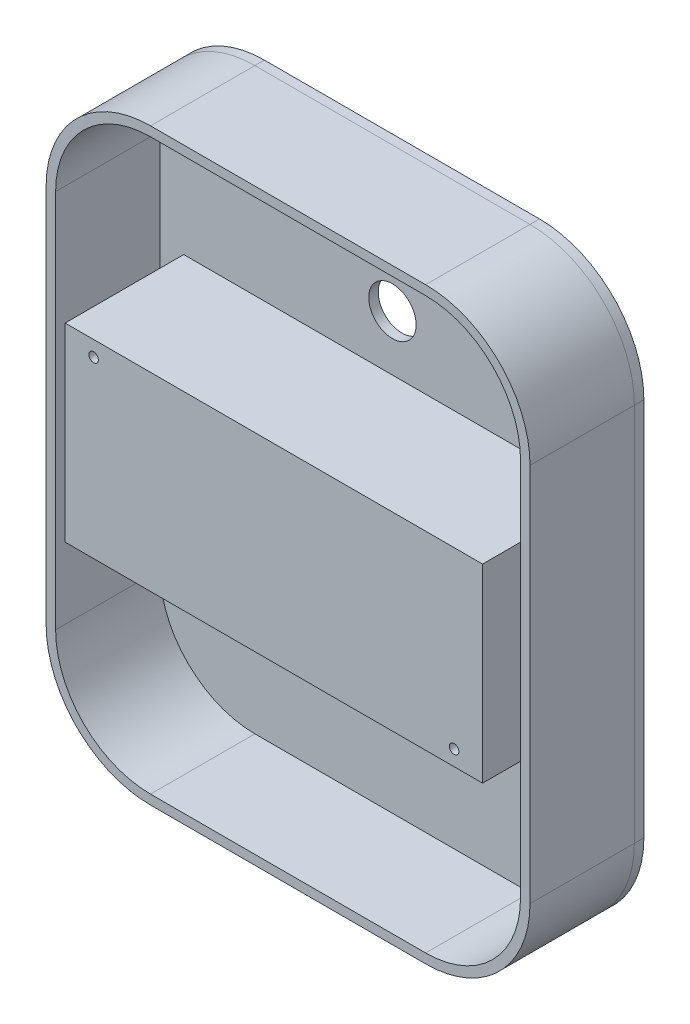
ISO-10303-21;
HEADER;
FILE_DESCRIPTION(('STEP AP214'),'2;1');
FILE_NAME('part.step','',(''),(''),'','','');
FILE_SCHEMA(('AUTOMOTIVE_DESIGN { 1 0 10303 214 1 1 1 1 }'));
ENDSEC;
DATA;
#1=APPLICATION_CONTEXT('core data for automotive mechanical design processes');
#2=APPLICATION_PROTOCOL_DEFINITION('international standard','automotive_design',2000,#1);
#3=PRODUCT_CONTEXT('',#1,'mechanical');
#4=PRODUCT('Part','Part','',(#3));
#5=PRODUCT_RELATED_PRODUCT_CATEGORY('part','',(#4));
#6=PRODUCT_DEFINITION_FORMATION('','',#4);
#7=PRODUCT_DEFINITION_CONTEXT('part definition',#1,'design');
#8=PRODUCT_DEFINITION('design','',#6,#7);
#9=PRODUCT_DEFINITION_SHAPE('','',#8);
#10=(LENGTH_UNIT() NAMED_UNIT(*) SI_UNIT(.MILLI.,.METRE.));
#11=(NAMED_UNIT(*) PLANE_ANGLE_UNIT() SI_UNIT($,.RADIAN.));
#12=(NAMED_UNIT(*) SI_UNIT($,.STERADIAN.) SOLID_ANGLE_UNIT());
#13=UNCERTAINTY_MEASURE_WITH_UNIT(LENGTH_MEASURE(1.E-05),#10,'distance_accuracy_value','');
#14=(GEOMETRIC_REPRESENTATION_CONTEXT(3) GLOBAL_UNCERTAINTY_ASSIGNED_CONTEXT((#13)) GLOBAL_UNIT_ASSIGNED_CONTEXT((#10,
#11,#12)) REPRESENTATION_CONTEXT('',''));
#15=CARTESIAN_POINT('',(0.,0.,0.));
#16=DIRECTION('',(0.,0.,1.));
#17=DIRECTION('',(1.,0.,0.));
#18=AXIS2_PLACEMENT_3D('',#15,#16,#17);
#19=CARTESIAN_POINT('',(0.,0.,25.));
#20=DIRECTION('',(0.,0.,1.));
#21=DIRECTION('',(1.,0.,0.));
#22=AXIS2_PLACEMENT_3D('',#19,#20,#21);
#23=PLANE('',#22);
#24=CARTESIAN_POINT('',(-38.,16.75,25.));
#25=DIRECTION('',(0.,0.,1.));
#26=DIRECTION('',(1.,0.,0.));
#27=AXIS2_PLACEMENT_3D('',#24,#25,#26);
#28=CIRCLE('',#27,0.999999999999998);
#29=CARTESIAN_POINT('',(-37.,16.75,25.));
#30=VERTEX_POINT('',#29);
#31=EDGE_CURVE('E220',#30,#30,#28,.T.);
#32=ORIENTED_EDGE('',*,*,#31,.F.);
#33=EDGE_LOOP('',(#32));
#34=FACE_BOUND('',#33,.T.);
#35=DIRECTION('',(1.,0.,0.));
#36=VECTOR('',#35,1.);
#37=CARTESIAN_POINT('',(-43.9999999999999,-20.,25.));
#38=LINE('',#37,#36);
#39=CARTESIAN_POINT('',(-43.9999999999999,-20.,25.));
#40=VERTEX_POINT('',#39);
#41=CARTESIAN_POINT('',(44.0000000000001,-19.9999999999997,25.));
#42=VERTEX_POINT('',#41);
#43=EDGE_CURVE('E226',#40,#42,#38,.T.);
#44=ORIENTED_EDGE('',*,*,#43,.T.);
#45=DIRECTION('',(0.,1.,0.));
#46=VECTOR('',#45,1.);
#47=CARTESIAN_POINT('',(44.0000000000001,-19.9999999999997,25.));
#48=LINE('',#47,#46);
#49=CARTESIAN_POINT('',(44.0000000000001,20.,25.));
#50=VERTEX_POINT('',#49);
#51=EDGE_CURVE('E228',#42,#50,#48,.T.);
#52=ORIENTED_EDGE('',*,*,#51,.T.);
#53=DIRECTION('',(-1.,0.,0.));
#54=VECTOR('',#53,1.);
#55=CARTESIAN_POINT('',(-44.,20.,25.));
#56=LINE('',#55,#54);
#57=CARTESIAN_POINT('',(-44.,20.,25.));
#58=VERTEX_POINT('',#57);
#59=EDGE_CURVE('E231',#50,#58,#56,.T.);
#60=ORIENTED_EDGE('',*,*,#59,.T.);
#61=DIRECTION('',(0.,-1.,0.));
#62=VECTOR('',#61,1.);
#63=CARTESIAN_POINT('',(-43.9999999999999,-20.,25.));
#64=LINE('',#63,#62);
#65=EDGE_CURVE('E65',#58,#40,#64,.T.);
#66=ORIENTED_EDGE('',*,*,#65,.T.);
#67=EDGE_LOOP('',(#44,#52,#60,#66));
#68=FACE_BOUND('',#67,.T.);
#69=CARTESIAN_POINT('',(38.,-16.75,25.));
#70=DIRECTION('',(0.,0.,1.));
#71=DIRECTION('',(1.,0.,0.));
#72=AXIS2_PLACEMENT_3D('',#69,#70,#71);
#73=CIRCLE('',#72,0.999999999999998);
#74=CARTESIAN_POINT('',(39.,-16.75,25.));
#75=VERTEX_POINT('',#74);
#76=EDGE_CURVE('E214',#75,#75,#73,.T.);
#77=ORIENTED_EDGE('',*,*,#76,.F.);
#78=EDGE_LOOP('',(#77));
#79=FACE_BOUND('',#78,.T.);
#80=ADVANCED_FACE('F49',(#34,#68,#79),#23,.T.);
#81=CARTESIAN_POINT('',(-43.9999999999999,-20.,25.));
#82=DIRECTION('',(0.,1.,0.));
#83=DIRECTION('',(-1.,0.,0.));
#84=AXIS2_PLACEMENT_3D('',#81,#82,#83);
#85=PLANE('',#84);
#86=DIRECTION('',(1.,0.,0.));
#87=VECTOR('',#86,1.);
#88=CARTESIAN_POINT('',(-43.9999999999999,-20.,0.));
#89=LINE('',#88,#87);
#90=CARTESIAN_POINT('',(-43.9999999999999,-20.,0.));
#91=VERTEX_POINT('',#90);
#92=CARTESIAN_POINT('',(44.0000000000001,-19.9999999999997,0.));
#93=VERTEX_POINT('',#92);
#94=EDGE_CURVE('E223',#91,#93,#89,.T.);
#95=ORIENTED_EDGE('',*,*,#94,.T.);
#96=DIRECTION('',(0.,0.,-1.));
#97=VECTOR('',#96,1.);
#98=CARTESIAN_POINT('',(44.0000000000001,-19.9999999999997,25.));
#99=LINE('',#98,#97);
#100=EDGE_CURVE('E12',#42,#93,#99,.T.);
#101=ORIENTED_EDGE('',*,*,#100,.F.);
#102=ORIENTED_EDGE('',*,*,#43,.F.);
#103=DIRECTION('',(0.,0.,-1.));
#104=VECTOR('',#103,1.);
#105=CARTESIAN_POINT('',(-43.9999999999999,-20.,25.));
#106=LINE('',#105,#104);
#107=EDGE_CURVE('E234',#40,#91,#106,.T.);
#108=ORIENTED_EDGE('',*,*,#107,.T.);
#109=EDGE_LOOP('',(#95,#101,#102,#108));
#110=FACE_BOUND('',#109,.T.);
#111=ADVANCED_FACE('F51',(#110),#85,.F.);
#112=CARTESIAN_POINT('',(44.0000000000001,-19.9999999999997,25.));
#113=DIRECTION('',(-1.,0.,0.));
#114=DIRECTION('',(0.,-1.,0.));
#115=AXIS2_PLACEMENT_3D('',#112,#113,#114);
#116=PLANE('',#115);
#117=DIRECTION('',(0.,1.,0.));
#118=VECTOR('',#117,1.);
#119=CARTESIAN_POINT('',(44.0000000000001,-19.9999999999997,0.));
#120=LINE('',#119,#118);
#121=CARTESIAN_POINT('',(44.0000000000001,20.,0.));
#122=VERTEX_POINT('',#121);
#123=EDGE_CURVE('E237',#93,#122,#120,.T.);
#124=ORIENTED_EDGE('',*,*,#123,.T.);
#125=DIRECTION('',(0.,0.,-1.));
#126=VECTOR('',#125,1.);
#127=CARTESIAN_POINT('',(44.0000000000001,20.,25.));
#128=LINE('',#127,#126);
#129=EDGE_CURVE('E58',#50,#122,#128,.T.);
#130=ORIENTED_EDGE('',*,*,#129,.F.);
#131=ORIENTED_EDGE('',*,*,#51,.F.);
#132=ORIENTED_EDGE('',*,*,#100,.T.);
#133=EDGE_LOOP('',(#124,#130,#131,#132));
#134=FACE_BOUND('',#133,.T.);
#135=ADVANCED_FACE('F257',(#134),#116,.F.);
#136=CARTESIAN_POINT('',(-44.,20.,25.));
#137=DIRECTION('',(0.,-1.,0.));
#138=DIRECTION('',(1.,0.,0.));
#139=AXIS2_PLACEMENT_3D('',#136,#137,#138);
#140=PLANE('',#139);
#141=DIRECTION('',(-1.,0.,0.));
#142=VECTOR('',#141,1.);
#143=CARTESIAN_POINT('',(-44.,20.,0.));
#144=LINE('',#143,#142);
#145=CARTESIAN_POINT('',(-44.,20.,0.));
#146=VERTEX_POINT('',#145);
#147=EDGE_CURVE('E240',#122,#146,#144,.T.);
#148=ORIENTED_EDGE('',*,*,#147,.T.);
#149=DIRECTION('',(0.,0.,-1.));
#150=VECTOR('',#149,1.);
#151=CARTESIAN_POINT('',(-44.,20.,25.));
#152=LINE('',#151,#150);
#153=EDGE_CURVE('E247',#58,#146,#152,.T.);
#154=ORIENTED_EDGE('',*,*,#153,.F.);
#155=ORIENTED_EDGE('',*,*,#59,.F.);
#156=ORIENTED_EDGE('',*,*,#129,.T.);
#157=EDGE_LOOP('',(#148,#154,#155,#156));
#158=FACE_BOUND('',#157,.T.);
#159=ADVANCED_FACE('F253',(#158),#140,.F.);
#160=CARTESIAN_POINT('',(-43.9999999999999,-20.,25.));
#161=DIRECTION('',(1.,0.,0.));
#162=DIRECTION('',(0.,1.,0.));
#163=AXIS2_PLACEMENT_3D('',#160,#161,#162);
#164=PLANE('',#163);
#165=DIRECTION('',(0.,-1.,0.));
#166=VECTOR('',#165,1.);
#167=CARTESIAN_POINT('',(-43.9999999999999,-20.,0.));
#168=LINE('',#167,#166);
#169=EDGE_CURVE('E229',#146,#91,#168,.T.);
#170=ORIENTED_EDGE('',*,*,#169,.T.);
#171=ORIENTED_EDGE('',*,*,#107,.F.);
#172=ORIENTED_EDGE('',*,*,#65,.F.);
#173=ORIENTED_EDGE('',*,*,#153,.T.);
#174=EDGE_LOOP('',(#170,#171,#172,#173));
#175=FACE_BOUND('',#174,.T.);
#176=ADVANCED_FACE('F263',(#175),#164,.F.);
#177=CARTESIAN_POINT('',(-38.,16.75,25.));
#178=DIRECTION('',(0.,0.,-1.));
#179=DIRECTION('',(-1.,0.,0.));
#180=AXIS2_PLACEMENT_3D('',#177,#178,#179);
#181=CYLINDRICAL_SURFACE('',#180,0.999999999999998);
#182=ORIENTED_EDGE('',*,*,#31,.T.);
#183=EDGE_LOOP('',(#182));
#184=FACE_BOUND('',#183,.T.);
#185=CARTESIAN_POINT('',(-38.,16.75,0.));
#186=DIRECTION('',(0.,0.,1.));
#187=DIRECTION('',(1.,0.,0.));
#188=AXIS2_PLACEMENT_3D('',#185,#186,#187);
#189=CIRCLE('',#188,0.999999999999998);
#190=CARTESIAN_POINT('',(-37.,16.75,0.));
#191=VERTEX_POINT('',#190);
#192=EDGE_CURVE('E217',#191,#191,#189,.T.);
#193=ORIENTED_EDGE('',*,*,#192,.F.);
#194=EDGE_LOOP('',(#193));
#195=FACE_BOUND('',#194,.T.);
#196=ADVANCED_FACE('F276',(#184,#195),#181,.F.);
#197=CARTESIAN_POINT('',(38.,-16.75,25.));
#198=DIRECTION('',(0.,0.,-1.));
#199=DIRECTION('',(-1.,0.,0.));
#200=AXIS2_PLACEMENT_3D('',#197,#198,#199);
#201=CYLINDRICAL_SURFACE('',#200,0.999999999999998);
#202=ORIENTED_EDGE('',*,*,#76,.T.);
#203=EDGE_LOOP('',(#202));
#204=FACE_BOUND('',#203,.T.);
#205=CARTESIAN_POINT('',(38.,-16.75,0.));
#206=DIRECTION('',(0.,0.,1.));
#207=DIRECTION('',(1.,0.,0.));
#208=AXIS2_PLACEMENT_3D('',#205,#206,#207);
#209=CIRCLE('',#208,0.999999999999998);
#210=CARTESIAN_POINT('',(39.,-16.75,0.));
#211=VERTEX_POINT('',#210);
#212=EDGE_CURVE('E202',#211,#211,#209,.T.);
#213=ORIENTED_EDGE('',*,*,#212,.F.);
#214=EDGE_LOOP('',(#213));
#215=FACE_BOUND('',#214,.T.);
#216=ADVANCED_FACE('F272',(#204,#215),#201,.F.);
#217=CARTESIAN_POINT('',(-29.,40.,0.));
#218=DIRECTION('',(0.,0.,-1.));
#219=DIRECTION('',(-1.,0.,0.));
#220=AXIS2_PLACEMENT_3D('',#217,#218,#219);
#221=PLANE('',#220);
#222=ORIENTED_EDGE('',*,*,#212,.T.);
#223=EDGE_LOOP('',(#222));
#224=FACE_BOUND('',#223,.T.);
#225=ADVANCED_FACE('F275',(#224),#221,.F.);
#226=ORIENTED_EDGE('',*,*,#192,.T.);
#227=EDGE_LOOP('',(#226));
#228=FACE_BOUND('',#227,.T.);
#229=ADVANCED_FACE('F281',(#228),#221,.F.);
#230=CARTESIAN_POINT('',(-29.,40.,-2.));
#231=DIRECTION('',(0.,0.,1.));
#232=DIRECTION('',(1.,0.,0.));
#233=AXIS2_PLACEMENT_3D('',#230,#231,#232);
#234=CYLINDRICAL_SURFACE('',#233,22.);
#235=CARTESIAN_POINT('',(-29.,40.,0.));
#236=DIRECTION('',(0.,0.,1.));
#237=DIRECTION('',(-1.,0.,0.));
#238=AXIS2_PLACEMENT_3D('',#235,#236,#237);
#239=CIRCLE('',#238,22.);
#240=CARTESIAN_POINT('',(-29.,62.,0.));
#241=VERTEX_POINT('',#240);
#242=CARTESIAN_POINT('',(-51.,40.,0.));
#243=VERTEX_POINT('',#242);
#244=EDGE_CURVE('E183',#241,#243,#239,.T.);
#245=ORIENTED_EDGE('',*,*,#244,.F.);
#246=DIRECTION('',(0.,0.,1.));
#247=VECTOR('',#246,1.);
#248=CARTESIAN_POINT('',(-29.,62.,-2.));
#249=LINE('',#248,#247);
#250=CARTESIAN_POINT('',(-29.,62.,-2.));
#251=VERTEX_POINT('',#250);
#252=EDGE_CURVE('E159',#251,#241,#249,.T.);
#253=ORIENTED_EDGE('',*,*,#252,.F.);
#254=CARTESIAN_POINT('',(-29.,40.,-2.));
#255=DIRECTION('',(0.,0.,1.));
#256=DIRECTION('',(-1.,0.,0.));
#257=AXIS2_PLACEMENT_3D('',#254,#255,#256);
#258=CIRCLE('',#257,22.);
#259=CARTESIAN_POINT('',(-51.,40.,-2.));
#260=VERTEX_POINT('',#259);
#261=EDGE_CURVE('E152',#251,#260,#258,.T.);
#262=ORIENTED_EDGE('',*,*,#261,.T.);
#263=DIRECTION('',(0.,0.,1.));
#264=VECTOR('',#263,1.);
#265=CARTESIAN_POINT('',(-51.,40.,-2.));
#266=LINE('',#265,#264);
#267=EDGE_CURVE('E134',#260,#243,#266,.T.);
#268=ORIENTED_EDGE('',*,*,#267,.T.);
#269=EDGE_LOOP('',(#245,#253,#262,#268));
#270=FACE_BOUND('',#269,.T.);
#271=ADVANCED_FACE('F158',(#270),#234,.T.);
#272=CARTESIAN_POINT('',(-29.,62.,-2.));
#273=DIRECTION('',(0.,1.,0.));
#274=DIRECTION('',(0.,0.,1.));
#275=AXIS2_PLACEMENT_3D('',#272,#273,#274);
#276=PLANE('',#275);
#277=DIRECTION('',(-1.,0.,0.));
#278=VECTOR('',#277,1.);
#279=CARTESIAN_POINT('',(-29.,62.,0.));
#280=LINE('',#279,#278);
#281=CARTESIAN_POINT('',(29.,62.,0.));
#282=VERTEX_POINT('',#281);
#283=EDGE_CURVE('E160',#282,#241,#280,.T.);
#284=ORIENTED_EDGE('',*,*,#283,.F.);
#285=DIRECTION('',(0.,0.,1.));
#286=VECTOR('',#285,1.);
#287=CARTESIAN_POINT('',(29.,62.,-2.));
#288=LINE('',#287,#286);
#289=CARTESIAN_POINT('',(29.,62.,-2.));
#290=VERTEX_POINT('',#289);
#291=EDGE_CURVE('E203',#290,#282,#288,.T.);
#292=ORIENTED_EDGE('',*,*,#291,.F.);
#293=DIRECTION('',(-1.,0.,0.));
#294=VECTOR('',#293,1.);
#295=CARTESIAN_POINT('',(-29.,62.,-2.));
#296=LINE('',#295,#294);
#297=EDGE_CURVE('E145',#290,#251,#296,.T.);
#298=ORIENTED_EDGE('',*,*,#297,.T.);
#299=ORIENTED_EDGE('',*,*,#252,.T.);
#300=EDGE_LOOP('',(#284,#292,#298,#299));
#301=FACE_BOUND('',#300,.T.);
#302=ADVANCED_FACE('F350',(#301),#276,.T.);
#303=CARTESIAN_POINT('',(29.,40.,-2.));
#304=DIRECTION('',(0.,0.,1.));
#305=DIRECTION('',(1.,0.,0.));
#306=AXIS2_PLACEMENT_3D('',#303,#304,#305);
#307=CYLINDRICAL_SURFACE('',#306,22.);
#308=CARTESIAN_POINT('',(29.,40.,0.));
#309=DIRECTION('',(0.,0.,1.));
#310=DIRECTION('',(1.,0.,0.));
#311=AXIS2_PLACEMENT_3D('',#308,#309,#310);
#312=CIRCLE('',#311,22.);
#313=CARTESIAN_POINT('',(51.,40.,0.));
#314=VERTEX_POINT('',#313);
#315=EDGE_CURVE('E163',#314,#282,#312,.T.);
#316=ORIENTED_EDGE('',*,*,#315,.F.);
#317=DIRECTION('',(0.,0.,1.));
#318=VECTOR('',#317,1.);
#319=CARTESIAN_POINT('',(51.,40.,-2.));
#320=LINE('',#319,#318);
#321=CARTESIAN_POINT('',(51.,40.,-2.));
#322=VERTEX_POINT('',#321);
#323=EDGE_CURVE('E205',#322,#314,#320,.T.);
#324=ORIENTED_EDGE('',*,*,#323,.F.);
#325=CARTESIAN_POINT('',(29.,40.,-2.));
#326=DIRECTION('',(0.,0.,1.));
#327=DIRECTION('',(1.,0.,0.));
#328=AXIS2_PLACEMENT_3D('',#325,#326,#327);
#329=CIRCLE('',#328,22.);
#330=EDGE_CURVE('E179',#322,#290,#329,.T.);
#331=ORIENTED_EDGE('',*,*,#330,.T.);
#332=ORIENTED_EDGE('',*,*,#291,.T.);
#333=EDGE_LOOP('',(#316,#324,#331,#332));
#334=FACE_BOUND('',#333,.T.);
#335=ADVANCED_FACE('F462',(#334),#307,.T.);
#336=CARTESIAN_POINT('',(51.,40.,-2.));
#337=DIRECTION('',(1.,0.,0.));
#338=DIRECTION('',(0.,1.,0.));
#339=AXIS2_PLACEMENT_3D('',#336,#337,#338);
#340=PLANE('',#339);
#341=DIRECTION('',(0.,1.,0.));
#342=VECTOR('',#341,1.);
#343=CARTESIAN_POINT('',(51.,40.,0.));
#344=LINE('',#343,#342);
#345=CARTESIAN_POINT('',(51.,-40.,0.));
#346=VERTEX_POINT('',#345);
#347=EDGE_CURVE('E196',#346,#314,#344,.T.);
#348=ORIENTED_EDGE('',*,*,#347,.F.);
#349=DIRECTION('',(0.,0.,1.));
#350=VECTOR('',#349,1.);
#351=CARTESIAN_POINT('',(51.,-40.,-2.));
#352=LINE('',#351,#350);
#353=CARTESIAN_POINT('',(51.,-40.,-2.));
#354=VERTEX_POINT('',#353);
#355=EDGE_CURVE('E207',#354,#346,#352,.T.);
#356=ORIENTED_EDGE('',*,*,#355,.F.);
#357=DIRECTION('',(0.,1.,0.));
#358=VECTOR('',#357,1.);
#359=CARTESIAN_POINT('',(51.,40.,-2.));
#360=LINE('',#359,#358);
#361=EDGE_CURVE('E176',#354,#322,#360,.T.);
#362=ORIENTED_EDGE('',*,*,#361,.T.);
#363=ORIENTED_EDGE('',*,*,#323,.T.);
#364=EDGE_LOOP('',(#348,#356,#362,#363));
#365=FACE_BOUND('',#364,.T.);
#366=ADVANCED_FACE('F357',(#365),#340,.T.);
#367=CARTESIAN_POINT('',(29.,-40.,-2.));
#368=DIRECTION('',(0.,0.,1.));
#369=DIRECTION('',(1.,0.,0.));
#370=AXIS2_PLACEMENT_3D('',#367,#368,#369);
#371=CYLINDRICAL_SURFACE('',#370,22.);
#372=CARTESIAN_POINT('',(29.,-40.,0.));
#373=DIRECTION('',(0.,0.,1.));
#374=DIRECTION('',(-1.,0.,0.));
#375=AXIS2_PLACEMENT_3D('',#372,#373,#374);
#376=CIRCLE('',#375,22.);
#377=CARTESIAN_POINT('',(29.,-62.,0.));
#378=VERTEX_POINT('',#377);
#379=EDGE_CURVE('E193',#378,#346,#376,.T.);
#380=ORIENTED_EDGE('',*,*,#379,.F.);
#381=DIRECTION('',(0.,0.,1.));
#382=VECTOR('',#381,1.);
#383=CARTESIAN_POINT('',(29.,-62.,-2.));
#384=LINE('',#383,#382);
#385=CARTESIAN_POINT('',(29.,-62.,-2.));
#386=VERTEX_POINT('',#385);
#387=EDGE_CURVE('E209',#386,#378,#384,.T.);
#388=ORIENTED_EDGE('',*,*,#387,.F.);
#389=CARTESIAN_POINT('',(29.,-40.,-2.));
#390=DIRECTION('',(0.,0.,1.));
#391=DIRECTION('',(-1.,0.,0.));
#392=AXIS2_PLACEMENT_3D('',#389,#390,#391);
#393=CIRCLE('',#392,22.);
#394=EDGE_CURVE('E173',#386,#354,#393,.T.);
#395=ORIENTED_EDGE('',*,*,#394,.T.);
#396=ORIENTED_EDGE('',*,*,#355,.T.);
#397=EDGE_LOOP('',(#380,#388,#395,#396));
#398=FACE_BOUND('',#397,.T.);
#399=ADVANCED_FACE('F360',(#398),#371,.T.);
#400=CARTESIAN_POINT('',(-29.,-62.,-2.));
#401=DIRECTION('',(0.,-1.,0.));
#402=DIRECTION('',(1.,0.,0.));
#403=AXIS2_PLACEMENT_3D('',#400,#401,#402);
#404=PLANE('',#403);
#405=DIRECTION('',(1.,0.,0.));
#406=VECTOR('',#405,1.);
#407=CARTESIAN_POINT('',(-29.,-62.,0.));
#408=LINE('',#407,#406);
#409=CARTESIAN_POINT('',(-29.,-62.,0.));
#410=VERTEX_POINT('',#409);
#411=EDGE_CURVE('E190',#410,#378,#408,.T.);
#412=ORIENTED_EDGE('',*,*,#411,.F.);
#413=DIRECTION('',(0.,0.,1.));
#414=VECTOR('',#413,1.);
#415=CARTESIAN_POINT('',(-29.,-62.,-2.));
#416=LINE('',#415,#414);
#417=CARTESIAN_POINT('',(-29.,-62.,-2.));
#418=VERTEX_POINT('',#417);
#419=EDGE_CURVE('E211',#418,#410,#416,.T.);
#420=ORIENTED_EDGE('',*,*,#419,.F.);
#421=DIRECTION('',(1.,0.,0.));
#422=VECTOR('',#421,1.);
#423=CARTESIAN_POINT('',(-29.,-62.,-2.));
#424=LINE('',#423,#422);
#425=EDGE_CURVE('E170',#418,#386,#424,.T.);
#426=ORIENTED_EDGE('',*,*,#425,.T.);
#427=ORIENTED_EDGE('',*,*,#387,.T.);
#428=EDGE_LOOP('',(#412,#420,#426,#427));
#429=FACE_BOUND('',#428,.T.);
#430=ADVANCED_FACE('F363',(#429),#404,.T.);
#431=CARTESIAN_POINT('',(-29.,-40.,-2.));
#432=DIRECTION('',(0.,0.,1.));
#433=DIRECTION('',(1.,0.,0.));
#434=AXIS2_PLACEMENT_3D('',#431,#432,#433);
#435=CYLINDRICAL_SURFACE('',#434,22.);
#436=CARTESIAN_POINT('',(-29.,-40.,0.));
#437=DIRECTION('',(0.,0.,1.));
#438=DIRECTION('',(-1.,0.,0.));
#439=AXIS2_PLACEMENT_3D('',#436,#437,#438);
#440=CIRCLE('',#439,22.);
#441=CARTESIAN_POINT('',(-51.,-40.,0.));
#442=VERTEX_POINT('',#441);
#443=EDGE_CURVE('E187',#442,#410,#440,.T.);
#444=ORIENTED_EDGE('',*,*,#443,.F.);
#445=DIRECTION('',(0.,0.,1.));
#446=VECTOR('',#445,1.);
#447=CARTESIAN_POINT('',(-51.,-40.,-2.));
#448=LINE('',#447,#446);
#449=CARTESIAN_POINT('',(-51.,-40.,-2.));
#450=VERTEX_POINT('',#449);
#451=EDGE_CURVE('E144',#450,#442,#448,.T.);
#452=ORIENTED_EDGE('',*,*,#451,.F.);
#453=CARTESIAN_POINT('',(-29.,-40.,-2.));
#454=DIRECTION('',(0.,0.,1.));
#455=DIRECTION('',(-1.,0.,0.));
#456=AXIS2_PLACEMENT_3D('',#453,#454,#455);
#457=CIRCLE('',#456,22.);
#458=EDGE_CURVE('E156',#450,#418,#457,.T.);
#459=ORIENTED_EDGE('',*,*,#458,.T.);
#460=ORIENTED_EDGE('',*,*,#419,.T.);
#461=EDGE_LOOP('',(#444,#452,#459,#460));
#462=FACE_BOUND('',#461,.T.);
#463=ADVANCED_FACE('F302',(#462),#435,.T.);
#464=CARTESIAN_POINT('',(-51.,40.,-2.));
#465=DIRECTION('',(-1.,0.,0.));
#466=DIRECTION('',(0.,-1.,0.));
#467=AXIS2_PLACEMENT_3D('',#464,#465,#466);
#468=PLANE('',#467);
#469=DIRECTION('',(0.,-1.,0.));
#470=VECTOR('',#469,1.);
#471=CARTESIAN_POINT('',(-51.,40.,0.));
#472=LINE('',#471,#470);
#473=EDGE_CURVE('E139',#243,#442,#472,.T.);
#474=ORIENTED_EDGE('',*,*,#473,.F.);
#475=ORIENTED_EDGE('',*,*,#267,.F.);
#476=DIRECTION('',(0.,-1.,0.));
#477=VECTOR('',#476,1.);
#478=CARTESIAN_POINT('',(-51.,40.,-2.));
#479=LINE('',#478,#477);
#480=EDGE_CURVE('E137',#260,#450,#479,.T.);
#481=ORIENTED_EDGE('',*,*,#480,.T.);
#482=ORIENTED_EDGE('',*,*,#451,.T.);
#483=EDGE_LOOP('',(#474,#475,#481,#482));
#484=FACE_BOUND('',#483,.T.);
#485=ADVANCED_FACE('F136',(#484),#468,.T.);
#486=CARTESIAN_POINT('',(-29.,40.,-2.));
#487=DIRECTION('',(0.,0.,-1.));
#488=DIRECTION('',(-1.,0.,0.));
#489=AXIS2_PLACEMENT_3D('',#486,#487,#488);
#490=PLANE('',#489);
#491=CARTESIAN_POINT('',(0.,-30.7551205826151,-2.));
#492=DIRECTION('',(0.,0.,1.));
#493=DIRECTION('',(1.,0.,0.));
#494=AXIS2_PLACEMENT_3D('',#491,#492,#493);
#495=CIRCLE('',#494,5.);
#496=CARTESIAN_POINT('',(5.00000000000002,-30.7551205826151,-2.));
#497=VERTEX_POINT('',#496);
#498=EDGE_CURVE('E321',#497,#497,#495,.T.);
#499=ORIENTED_EDGE('',*,*,#498,.T.);
#500=EDGE_LOOP('',(#499));
#501=FACE_BOUND('',#500,.T.);
#502=CARTESIAN_POINT('',(0.,31.6596329985543,-2.));
#503=DIRECTION('',(0.,0.,1.));
#504=DIRECTION('',(1.,0.,0.));
#505=AXIS2_PLACEMENT_3D('',#502,#503,#504);
#506=CIRCLE('',#505,5.);
#507=CARTESIAN_POINT('',(5.,31.6596329985543,-2.));
#508=VERTEX_POINT('',#507);
#509=EDGE_CURVE('E329',#508,#508,#506,.T.);
#510=ORIENTED_EDGE('',*,*,#509,.T.);
#511=EDGE_LOOP('',(#510));
#512=FACE_BOUND('',#511,.T.);
#513=CARTESIAN_POINT('',(0.,-41.,-2.));
#514=DIRECTION('',(0.,0.,1.));
#515=DIRECTION('',(1.,0.,0.));
#516=AXIS2_PLACEMENT_3D('',#513,#514,#515);
#517=CIRCLE('',#516,1.75);
#518=CARTESIAN_POINT('',(1.75000000000001,-41.,-2.));
#519=VERTEX_POINT('',#518);
#520=EDGE_CURVE('E335',#519,#519,#517,.T.);
#521=ORIENTED_EDGE('',*,*,#520,.T.);
#522=EDGE_LOOP('',(#521));
#523=FACE_BOUND('',#522,.T.);
#524=CARTESIAN_POINT('',(0.,41.,-2.));
#525=DIRECTION('',(0.,0.,1.));
#526=DIRECTION('',(1.,0.,0.));
#527=AXIS2_PLACEMENT_3D('',#524,#525,#526);
#528=CIRCLE('',#527,1.75);
#529=CARTESIAN_POINT('',(1.75000000000001,41.,-2.));
#530=VERTEX_POINT('',#529);
#531=EDGE_CURVE('E185',#530,#530,#528,.T.);
#532=ORIENTED_EDGE('',*,*,#531,.T.);
#533=EDGE_LOOP('',(#532));
#534=FACE_BOUND('',#533,.T.);
#535=ORIENTED_EDGE('',*,*,#261,.F.);
#536=ORIENTED_EDGE('',*,*,#297,.F.);
#537=ORIENTED_EDGE('',*,*,#330,.F.);
#538=ORIENTED_EDGE('',*,*,#361,.F.);
#539=ORIENTED_EDGE('',*,*,#394,.F.);
#540=ORIENTED_EDGE('',*,*,#425,.F.);
#541=ORIENTED_EDGE('',*,*,#458,.F.);
#542=ORIENTED_EDGE('',*,*,#480,.F.);
#543=EDGE_LOOP('',(#535,#536,#537,#538,#539,#540,#541,#542));
#544=FACE_BOUND('',#543,.T.);
#545=ADVANCED_FACE('F150',(#501,#512,#523,#534,#544),#490,.T.);
#546=ORIENTED_EDGE('',*,*,#94,.F.);
#547=ORIENTED_EDGE('',*,*,#169,.F.);
#548=ORIENTED_EDGE('',*,*,#147,.F.);
#549=ORIENTED_EDGE('',*,*,#123,.F.);
#550=EDGE_LOOP('',(#546,#547,#548,#549));
#551=FACE_BOUND('',#550,.T.);
#552=CARTESIAN_POINT('',(0.,-30.7551205826151,0.));
#553=DIRECTION('',(0.,0.,1.));
#554=DIRECTION('',(1.,0.,0.));
#555=AXIS2_PLACEMENT_3D('',#552,#553,#554);
#556=CIRCLE('',#555,5.);
#557=CARTESIAN_POINT('',(5.00000000000002,-30.7551205826151,0.));
#558=VERTEX_POINT('',#557);
#559=EDGE_CURVE('E324',#558,#558,#556,.T.);
#560=ORIENTED_EDGE('',*,*,#559,.F.);
#561=EDGE_LOOP('',(#560));
#562=FACE_BOUND('',#561,.T.);
#563=CARTESIAN_POINT('',(0.,31.6596329985543,0.));
#564=DIRECTION('',(0.,0.,1.));
#565=DIRECTION('',(1.,0.,0.));
#566=AXIS2_PLACEMENT_3D('',#563,#564,#565);
#567=CIRCLE('',#566,5.);
#568=CARTESIAN_POINT('',(5.,31.6596329985543,0.));
#569=VERTEX_POINT('',#568);
#570=EDGE_CURVE('E326',#569,#569,#567,.T.);
#571=ORIENTED_EDGE('',*,*,#570,.F.);
#572=EDGE_LOOP('',(#571));
#573=FACE_BOUND('',#572,.T.);
#574=CARTESIAN_POINT('',(0.,-41.,0.));
#575=DIRECTION('',(0.,0.,1.));
#576=DIRECTION('',(1.,0.,0.));
#577=AXIS2_PLACEMENT_3D('',#574,#575,#576);
#578=CIRCLE('',#577,1.75);
#579=CARTESIAN_POINT('',(1.75000000000001,-41.,0.));
#580=VERTEX_POINT('',#579);
#581=EDGE_CURVE('E332',#580,#580,#578,.T.);
#582=ORIENTED_EDGE('',*,*,#581,.F.);
#583=EDGE_LOOP('',(#582));
#584=FACE_BOUND('',#583,.T.);
#585=CARTESIAN_POINT('',(0.,41.,0.));
#586=DIRECTION('',(0.,0.,1.));
#587=DIRECTION('',(1.,0.,0.));
#588=AXIS2_PLACEMENT_3D('',#585,#586,#587);
#589=CIRCLE('',#588,1.75);
#590=CARTESIAN_POINT('',(1.75000000000001,41.,0.));
#591=VERTEX_POINT('',#590);
#592=EDGE_CURVE('E166',#591,#591,#589,.T.);
#593=ORIENTED_EDGE('',*,*,#592,.F.);
#594=EDGE_LOOP('',(#593));
#595=FACE_BOUND('',#594,.T.);
#596=ORIENTED_EDGE('',*,*,#244,.T.);
#597=ORIENTED_EDGE('',*,*,#473,.T.);
#598=ORIENTED_EDGE('',*,*,#443,.T.);
#599=ORIENTED_EDGE('',*,*,#411,.T.);
#600=ORIENTED_EDGE('',*,*,#379,.T.);
#601=ORIENTED_EDGE('',*,*,#347,.T.);
#602=ORIENTED_EDGE('',*,*,#315,.T.);
#603=ORIENTED_EDGE('',*,*,#283,.T.);
#604=EDGE_LOOP('',(#596,#597,#598,#599,#600,#601,#602,#603));
#605=FACE_BOUND('',#604,.T.);
#606=ADVANCED_FACE('F260',(#551,#562,#573,#584,#595,#605),#221,.F.);
#607=CARTESIAN_POINT('',(0.,41.,-2.));
#608=DIRECTION('',(0.,0.,1.));
#609=DIRECTION('',(1.,0.,0.));
#610=AXIS2_PLACEMENT_3D('',#607,#608,#609);
#611=CYLINDRICAL_SURFACE('',#610,1.75);
#612=ORIENTED_EDGE('',*,*,#531,.F.);
#613=EDGE_LOOP('',(#612));
#614=FACE_BOUND('',#613,.T.);
#615=ORIENTED_EDGE('',*,*,#592,.T.);
#616=EDGE_LOOP('',(#615));
#617=FACE_BOUND('',#616,.T.);
#618=ADVANCED_FACE('F290',(#614,#617),#611,.F.);
#619=CARTESIAN_POINT('',(0.,-41.,-2.));
#620=DIRECTION('',(0.,0.,1.));
#621=DIRECTION('',(1.,0.,0.));
#622=AXIS2_PLACEMENT_3D('',#619,#620,#621);
#623=CYLINDRICAL_SURFACE('',#622,1.75);
#624=ORIENTED_EDGE('',*,*,#520,.F.);
#625=EDGE_LOOP('',(#624));
#626=FACE_BOUND('',#625,.T.);
#627=ORIENTED_EDGE('',*,*,#581,.T.);
#628=EDGE_LOOP('',(#627));
#629=FACE_BOUND('',#628,.T.);
#630=ADVANCED_FACE('F295',(#626,#629),#623,.F.);
#631=CARTESIAN_POINT('',(0.,31.6596329985543,-2.));
#632=DIRECTION('',(0.,0.,1.));
#633=DIRECTION('',(1.,0.,0.));
#634=AXIS2_PLACEMENT_3D('',#631,#632,#633);
#635=CYLINDRICAL_SURFACE('',#634,5.);
#636=ORIENTED_EDGE('',*,*,#509,.F.);
#637=EDGE_LOOP('',(#636));
#638=FACE_BOUND('',#637,.T.);
#639=ORIENTED_EDGE('',*,*,#570,.T.);
#640=EDGE_LOOP('',(#639));
#641=FACE_BOUND('',#640,.T.);
#642=ADVANCED_FACE('F309',(#638,#641),#635,.F.);
#643=CARTESIAN_POINT('',(0.,-30.7551205826151,-2.));
#644=DIRECTION('',(0.,0.,1.));
#645=DIRECTION('',(1.,0.,0.));
#646=AXIS2_PLACEMENT_3D('',#643,#644,#645);
#647=CYLINDRICAL_SURFACE('',#646,5.);
#648=ORIENTED_EDGE('',*,*,#498,.F.);
#649=EDGE_LOOP('',(#648));
#650=FACE_BOUND('',#649,.T.);
#651=ORIENTED_EDGE('',*,*,#559,.T.);
#652=EDGE_LOOP('',(#651));
#653=FACE_BOUND('',#652,.T.);
#654=ADVANCED_FACE('F313',(#650,#653),#647,.F.);
#655=CLOSED_SHELL('',(#80,#111,#135,#159,#176,#196,#216,#225,#229,#271,#302,#335,#366,#399,#430,
#463,#485,#545,#606,#618,#630,#642,#654));
#656=MANIFOLD_SOLID_BREP('B2',#655);
#657=CARTESIAN_POINT('',(-29.,40.,22.));
#658=DIRECTION('',(0.,0.,-1.));
#659=DIRECTION('',(-1.,0.,0.));
#660=AXIS2_PLACEMENT_3D('',#657,#658,#659);
#661=PLANE('',#660);
#662=CARTESIAN_POINT('',(-29.,40.,22.));
#663=DIRECTION('',(0.,0.,1.));
#664=DIRECTION('',(-1.,0.,0.));
#665=AXIS2_PLACEMENT_3D('',#662,#663,#664);
#666=CIRCLE('',#665,22.);
#667=CARTESIAN_POINT('',(-29.,62.,22.));
#668=VERTEX_POINT('',#667);
#669=CARTESIAN_POINT('',(-51.,40.,22.));
#670=VERTEX_POINT('',#669);
#671=EDGE_CURVE('E773',#668,#670,#666,.T.);
#672=ORIENTED_EDGE('',*,*,#671,.T.);
#673=DIRECTION('',(0.,-1.,0.));
#674=VECTOR('',#673,1.);
#675=CARTESIAN_POINT('',(-51.,40.,22.));
#676=LINE('',#675,#674);
#677=CARTESIAN_POINT('',(-51.,-40.,22.));
#678=VERTEX_POINT('',#677);
#679=EDGE_CURVE('E776',#670,#678,#676,.T.);
#680=ORIENTED_EDGE('',*,*,#679,.T.);
#681=CARTESIAN_POINT('',(-29.,-40.,22.));
#682=DIRECTION('',(0.,0.,1.));
#683=DIRECTION('',(-1.,0.,0.));
#684=AXIS2_PLACEMENT_3D('',#681,#682,#683);
#685=CIRCLE('',#684,22.);
#686=CARTESIAN_POINT('',(-29.,-62.,22.));
#687=VERTEX_POINT('',#686);
#688=EDGE_CURVE('E779',#678,#687,#685,.T.);
#689=ORIENTED_EDGE('',*,*,#688,.T.);
#690=DIRECTION('',(1.,0.,0.));
#691=VECTOR('',#690,1.);
#692=CARTESIAN_POINT('',(-29.,-62.,22.));
#693=LINE('',#692,#691);
#694=CARTESIAN_POINT('',(29.,-62.,22.));
#695=VERTEX_POINT('',#694);
#696=EDGE_CURVE('E781',#687,#695,#693,.T.);
#697=ORIENTED_EDGE('',*,*,#696,.T.);
#698=CARTESIAN_POINT('',(29.,-40.,22.));
#699=DIRECTION('',(0.,0.,1.));
#700=DIRECTION('',(-1.,0.,0.));
#701=AXIS2_PLACEMENT_3D('',#698,#699,#700);
#702=CIRCLE('',#701,22.);
#703=CARTESIAN_POINT('',(51.,-40.,22.));
#704=VERTEX_POINT('',#703);
#705=EDGE_CURVE('E783',#695,#704,#702,.T.);
#706=ORIENTED_EDGE('',*,*,#705,.T.);
#707=DIRECTION('',(0.,1.,0.));
#708=VECTOR('',#707,1.);
#709=CARTESIAN_POINT('',(51.,40.,22.));
#710=LINE('',#709,#708);
#711=CARTESIAN_POINT('',(51.,40.,22.));
#712=VERTEX_POINT('',#711);
#713=EDGE_CURVE('E785',#704,#712,#710,.T.);
#714=ORIENTED_EDGE('',*,*,#713,.T.);
#715=CARTESIAN_POINT('',(29.,40.,22.));
#716=DIRECTION('',(0.,0.,1.));
#717=DIRECTION('',(1.,0.,0.));
#718=AXIS2_PLACEMENT_3D('',#715,#716,#717);
#719=CIRCLE('',#718,22.);
#720=CARTESIAN_POINT('',(29.,62.,22.));
#721=VERTEX_POINT('',#720);
#722=EDGE_CURVE('E787',#712,#721,#719,.T.);
#723=ORIENTED_EDGE('',*,*,#722,.T.);
#724=DIRECTION('',(-1.,0.,0.));
#725=VECTOR('',#724,1.);
#726=CARTESIAN_POINT('',(-29.,62.,22.));
#727=LINE('',#726,#725);
#728=EDGE_CURVE('E789',#721,#668,#727,.T.);
#729=ORIENTED_EDGE('',*,*,#728,.T.);
#730=EDGE_LOOP('',(#672,#680,#689,#697,#706,#714,#723,#729));
#731=FACE_BOUND('',#730,.T.);
#732=CARTESIAN_POINT('',(29.,40.,22.));
#733=DIRECTION('',(0.,0.,1.));
#734=DIRECTION('',(1.,0.,0.));
#735=AXIS2_PLACEMENT_3D('',#732,#733,#734);
#736=CIRCLE('',#735,20.);
#737=CARTESIAN_POINT('',(49.,40.,22.));
#738=VERTEX_POINT('',#737);
#739=CARTESIAN_POINT('',(29.,60.,22.));
#740=VERTEX_POINT('',#739);
#741=EDGE_CURVE('E708',#738,#740,#736,.T.);
#742=ORIENTED_EDGE('',*,*,#741,.F.);
#743=DIRECTION('',(0.,1.,0.));
#744=VECTOR('',#743,1.);
#745=CARTESIAN_POINT('',(49.,40.,22.));
#746=LINE('',#745,#744);
#747=CARTESIAN_POINT('',(49.,-40.,22.));
#748=VERTEX_POINT('',#747);
#749=EDGE_CURVE('E741',#748,#738,#746,.T.);
#750=ORIENTED_EDGE('',*,*,#749,.F.);
#751=CARTESIAN_POINT('',(29.,-40.,22.));
#752=DIRECTION('',(0.,0.,1.));
#753=DIRECTION('',(-1.,0.,0.));
#754=AXIS2_PLACEMENT_3D('',#751,#752,#753);
#755=CIRCLE('',#754,20.);
#756=CARTESIAN_POINT('',(29.,-60.,22.));
#757=VERTEX_POINT('',#756);
#758=EDGE_CURVE('E739',#757,#748,#755,.T.);
#759=ORIENTED_EDGE('',*,*,#758,.F.);
#760=DIRECTION('',(1.,0.,0.));
#761=VECTOR('',#760,1.);
#762=CARTESIAN_POINT('',(-29.,-60.,22.));
#763=LINE('',#762,#761);
#764=CARTESIAN_POINT('',(-29.,-60.,22.));
#765=VERTEX_POINT('',#764);
#766=EDGE_CURVE('E737',#765,#757,#763,.T.);
#767=ORIENTED_EDGE('',*,*,#766,.F.);
#768=CARTESIAN_POINT('',(-29.,-40.,22.));
#769=DIRECTION('',(0.,0.,1.));
#770=DIRECTION('',(-1.,0.,0.));
#771=AXIS2_PLACEMENT_3D('',#768,#769,#770);
#772=CIRCLE('',#771,20.);
#773=CARTESIAN_POINT('',(-49.,-40.,22.));
#774=VERTEX_POINT('',#773);
#775=EDGE_CURVE('E735',#774,#765,#772,.T.);
#776=ORIENTED_EDGE('',*,*,#775,.F.);
#777=DIRECTION('',(0.,-1.,0.));
#778=VECTOR('',#777,1.);
#779=CARTESIAN_POINT('',(-49.,40.,22.));
#780=LINE('',#779,#778);
#781=CARTESIAN_POINT('',(-49.,40.,22.));
#782=VERTEX_POINT('',#781);
#783=EDGE_CURVE('E731',#782,#774,#780,.T.);
#784=ORIENTED_EDGE('',*,*,#783,.F.);
#785=CARTESIAN_POINT('',(-29.,40.,22.));
#786=DIRECTION('',(0.,0.,1.));
#787=DIRECTION('',(-1.,0.,0.));
#788=AXIS2_PLACEMENT_3D('',#785,#786,#787);
#789=CIRCLE('',#788,20.);
#790=CARTESIAN_POINT('',(-29.,60.,22.));
#791=VERTEX_POINT('',#790);
#792=EDGE_CURVE('E729',#791,#782,#789,.T.);
#793=ORIENTED_EDGE('',*,*,#792,.F.);
#794=DIRECTION('',(-1.,0.,0.));
#795=VECTOR('',#794,1.);
#796=CARTESIAN_POINT('',(-29.,60.,22.));
#797=LINE('',#796,#795);
#798=EDGE_CURVE('E716',#740,#791,#797,.T.);
#799=ORIENTED_EDGE('',*,*,#798,.F.);
#800=EDGE_LOOP('',(#742,#750,#759,#767,#776,#784,#793,#799));
#801=FACE_BOUND('',#800,.T.);
#802=ADVANCED_FACE('F595',(#731,#801),#661,.F.);
#803=CARTESIAN_POINT('',(-29.,40.,0.));
#804=DIRECTION('',(0.,0.,-1.));
#805=DIRECTION('',(-1.,0.,0.));
#806=AXIS2_PLACEMENT_3D('',#803,#804,#805);
#807=PLANE('',#806);
#808=CARTESIAN_POINT('',(-29.,40.,0.));
#809=DIRECTION('',(0.,0.,1.));
#810=DIRECTION('',(-1.,0.,0.));
#811=AXIS2_PLACEMENT_3D('',#808,#809,#810);
#812=CIRCLE('',#811,22.);
#813=CARTESIAN_POINT('',(-29.,62.,0.));
#814=VERTEX_POINT('',#813);
#815=CARTESIAN_POINT('',(-51.,40.,0.));
#816=VERTEX_POINT('',#815);
#817=EDGE_CURVE('E724',#814,#816,#812,.T.);
#818=ORIENTED_EDGE('',*,*,#817,.F.);
#819=DIRECTION('',(-1.,0.,0.));
#820=VECTOR('',#819,1.);
#821=CARTESIAN_POINT('',(-29.,62.,0.));
#822=LINE('',#821,#820);
#823=CARTESIAN_POINT('',(29.,62.,0.));
#824=VERTEX_POINT('',#823);
#825=EDGE_CURVE('E777',#824,#814,#822,.T.);
#826=ORIENTED_EDGE('',*,*,#825,.F.);
#827=CARTESIAN_POINT('',(29.,40.,0.));
#828=DIRECTION('',(0.,0.,1.));
#829=DIRECTION('',(1.,0.,0.));
#830=AXIS2_PLACEMENT_3D('',#827,#828,#829);
#831=CIRCLE('',#830,22.);
#832=CARTESIAN_POINT('',(51.,40.,0.));
#833=VERTEX_POINT('',#832);
#834=EDGE_CURVE('E804',#833,#824,#831,.T.);
#835=ORIENTED_EDGE('',*,*,#834,.F.);
#836=DIRECTION('',(0.,1.,0.));
#837=VECTOR('',#836,1.);
#838=CARTESIAN_POINT('',(51.,40.,0.));
#839=LINE('',#838,#837);
#840=CARTESIAN_POINT('',(51.,-40.,0.));
#841=VERTEX_POINT('',#840);
#842=EDGE_CURVE('E802',#841,#833,#839,.T.);
#843=ORIENTED_EDGE('',*,*,#842,.F.);
#844=CARTESIAN_POINT('',(29.,-40.,0.));
#845=DIRECTION('',(0.,0.,1.));
#846=DIRECTION('',(-1.,0.,0.));
#847=AXIS2_PLACEMENT_3D('',#844,#845,#846);
#848=CIRCLE('',#847,22.);
#849=CARTESIAN_POINT('',(29.,-62.,0.));
#850=VERTEX_POINT('',#849);
#851=EDGE_CURVE('E800',#850,#841,#848,.T.);
#852=ORIENTED_EDGE('',*,*,#851,.F.);
#853=DIRECTION('',(1.,0.,0.));
#854=VECTOR('',#853,1.);
#855=CARTESIAN_POINT('',(-29.,-62.,0.));
#856=LINE('',#855,#854);
#857=CARTESIAN_POINT('',(-29.,-62.,0.));
#858=VERTEX_POINT('',#857);
#859=EDGE_CURVE('E798',#858,#850,#856,.T.);
#860=ORIENTED_EDGE('',*,*,#859,.F.);
#861=CARTESIAN_POINT('',(-29.,-40.,0.));
#862=DIRECTION('',(0.,0.,1.));
#863=DIRECTION('',(-1.,0.,0.));
#864=AXIS2_PLACEMENT_3D('',#861,#862,#863);
#865=CIRCLE('',#864,22.);
#866=CARTESIAN_POINT('',(-51.,-40.,0.));
#867=VERTEX_POINT('',#866);
#868=EDGE_CURVE('E796',#867,#858,#865,.T.);
#869=ORIENTED_EDGE('',*,*,#868,.F.);
#870=DIRECTION('',(0.,-1.,0.));
#871=VECTOR('',#870,1.);
#872=CARTESIAN_POINT('',(-51.,40.,0.));
#873=LINE('',#872,#871);
#874=EDGE_CURVE('E794',#816,#867,#873,.T.);
#875=ORIENTED_EDGE('',*,*,#874,.F.);
#876=EDGE_LOOP('',(#818,#826,#835,#843,#852,#860,#869,#875));
#877=FACE_BOUND('',#876,.T.);
#878=DIRECTION('',(0.,1.,0.));
#879=VECTOR('',#878,1.);
#880=CARTESIAN_POINT('',(49.,40.,0.));
#881=LINE('',#880,#879);
#882=CARTESIAN_POINT('',(49.,-40.,0.));
#883=VERTEX_POINT('',#882);
#884=CARTESIAN_POINT('',(49.,40.,0.));
#885=VERTEX_POINT('',#884);
#886=EDGE_CURVE('E717',#883,#885,#881,.T.);
#887=ORIENTED_EDGE('',*,*,#886,.T.);
#888=CARTESIAN_POINT('',(29.,40.,0.));
#889=DIRECTION('',(0.,0.,1.));
#890=DIRECTION('',(1.,0.,0.));
#891=AXIS2_PLACEMENT_3D('',#888,#889,#890);
#892=CIRCLE('',#891,20.);
#893=CARTESIAN_POINT('',(29.,60.,0.));
#894=VERTEX_POINT('',#893);
#895=EDGE_CURVE('E618',#885,#894,#892,.T.);
#896=ORIENTED_EDGE('',*,*,#895,.T.);
#897=DIRECTION('',(-1.,0.,0.));
#898=VECTOR('',#897,1.);
#899=CARTESIAN_POINT('',(-29.,60.,0.));
#900=LINE('',#899,#898);
#901=CARTESIAN_POINT('',(-29.,60.,0.));
#902=VERTEX_POINT('',#901);
#903=EDGE_CURVE('E723',#894,#902,#900,.T.);
#904=ORIENTED_EDGE('',*,*,#903,.T.);
#905=CARTESIAN_POINT('',(-29.,40.,0.));
#906=DIRECTION('',(0.,0.,1.));
#907=DIRECTION('',(-1.,0.,0.));
#908=AXIS2_PLACEMENT_3D('',#905,#906,#907);
#909=CIRCLE('',#908,20.);
#910=CARTESIAN_POINT('',(-49.,40.,0.));
#911=VERTEX_POINT('',#910);
#912=EDGE_CURVE('E745',#902,#911,#909,.T.);
#913=ORIENTED_EDGE('',*,*,#912,.T.);
#914=DIRECTION('',(0.,-1.,0.));
#915=VECTOR('',#914,1.);
#916=CARTESIAN_POINT('',(-49.,40.,0.));
#917=LINE('',#916,#915);
#918=CARTESIAN_POINT('',(-49.,-40.,0.));
#919=VERTEX_POINT('',#918);
#920=EDGE_CURVE('E748',#911,#919,#917,.T.);
#921=ORIENTED_EDGE('',*,*,#920,.T.);
#922=CARTESIAN_POINT('',(-29.,-40.,0.));
#923=DIRECTION('',(0.,0.,1.));
#924=DIRECTION('',(-1.,0.,0.));
#925=AXIS2_PLACEMENT_3D('',#922,#923,#924);
#926=CIRCLE('',#925,20.);
#927=CARTESIAN_POINT('',(-29.,-60.,0.));
#928=VERTEX_POINT('',#927);
#929=EDGE_CURVE('E751',#919,#928,#926,.T.);
#930=ORIENTED_EDGE('',*,*,#929,.T.);
#931=DIRECTION('',(1.,0.,0.));
#932=VECTOR('',#931,1.);
#933=CARTESIAN_POINT('',(-29.,-60.,0.));
#934=LINE('',#933,#932);
#935=CARTESIAN_POINT('',(29.,-60.,0.));
#936=VERTEX_POINT('',#935);
#937=EDGE_CURVE('E754',#928,#936,#934,.T.);
#938=ORIENTED_EDGE('',*,*,#937,.T.);
#939=CARTESIAN_POINT('',(29.,-40.,0.));
#940=DIRECTION('',(0.,0.,1.));
#941=DIRECTION('',(-1.,0.,0.));
#942=AXIS2_PLACEMENT_3D('',#939,#940,#941);
#943=CIRCLE('',#942,20.);
#944=EDGE_CURVE('E757',#936,#883,#943,.T.);
#945=ORIENTED_EDGE('',*,*,#944,.T.);
#946=EDGE_LOOP('',(#887,#896,#904,#913,#921,#930,#938,#945));
#947=FACE_BOUND('',#946,.T.);
#948=ADVANCED_FACE('F834',(#877,#947),#807,.T.);
#949=CARTESIAN_POINT('',(-29.,40.,22.));
#950=DIRECTION('',(0.,0.,-1.));
#951=DIRECTION('',(-1.,0.,0.));
#952=AXIS2_PLACEMENT_3D('',#949,#950,#951);
#953=CYLINDRICAL_SURFACE('',#952,22.);
#954=ORIENTED_EDGE('',*,*,#817,.T.);
#955=DIRECTION('',(0.,0.,-1.));
#956=VECTOR('',#955,1.);
#957=CARTESIAN_POINT('',(-51.,40.,22.));
#958=LINE('',#957,#956);
#959=EDGE_CURVE('E47',#670,#816,#958,.T.);
#960=ORIENTED_EDGE('',*,*,#959,.F.);
#961=ORIENTED_EDGE('',*,*,#671,.F.);
#962=DIRECTION('',(0.,0.,-1.));
#963=VECTOR('',#962,1.);
#964=CARTESIAN_POINT('',(-29.,62.,22.));
#965=LINE('',#964,#963);
#966=EDGE_CURVE('E791',#668,#814,#965,.T.);
#967=ORIENTED_EDGE('',*,*,#966,.T.);
#968=EDGE_LOOP('',(#954,#960,#961,#967));
#969=FACE_BOUND('',#968,.T.);
#970=ADVANCED_FACE('F597',(#969),#953,.T.);
#971=CARTESIAN_POINT('',(-51.,40.,22.));
#972=DIRECTION('',(1.,0.,0.));
#973=DIRECTION('',(0.,1.,0.));
#974=AXIS2_PLACEMENT_3D('',#971,#972,#973);
#975=PLANE('',#974);
#976=ORIENTED_EDGE('',*,*,#874,.T.);
#977=DIRECTION('',(0.,0.,-1.));
#978=VECTOR('',#977,1.);
#979=CARTESIAN_POINT('',(-51.,-40.,22.));
#980=LINE('',#979,#978);
#981=EDGE_CURVE('E603',#678,#867,#980,.T.);
#982=ORIENTED_EDGE('',*,*,#981,.F.);
#983=ORIENTED_EDGE('',*,*,#679,.F.);
#984=ORIENTED_EDGE('',*,*,#959,.T.);
#985=EDGE_LOOP('',(#976,#982,#983,#984));
#986=FACE_BOUND('',#985,.T.);
#987=ADVANCED_FACE('F851',(#986),#975,.F.);
#988=CARTESIAN_POINT('',(-29.,-40.,22.));
#989=DIRECTION('',(0.,0.,-1.));
#990=DIRECTION('',(-1.,0.,0.));
#991=AXIS2_PLACEMENT_3D('',#988,#989,#990);
#992=CYLINDRICAL_SURFACE('',#991,22.);
#993=ORIENTED_EDGE('',*,*,#868,.T.);
#994=DIRECTION('',(0.,0.,-1.));
#995=VECTOR('',#994,1.);
#996=CARTESIAN_POINT('',(-29.,-62.,22.));
#997=LINE('',#996,#995);
#998=EDGE_CURVE('E821',#687,#858,#997,.T.);
#999=ORIENTED_EDGE('',*,*,#998,.F.);
#1000=ORIENTED_EDGE('',*,*,#688,.F.);
#1001=ORIENTED_EDGE('',*,*,#981,.T.);
#1002=EDGE_LOOP('',(#993,#999,#1000,#1001));
#1003=FACE_BOUND('',#1002,.T.);
#1004=ADVANCED_FACE('F828',(#1003),#992,.T.);
#1005=CARTESIAN_POINT('',(-29.,-62.,22.));
#1006=DIRECTION('',(0.,1.,0.));
#1007=DIRECTION('',(-1.,0.,0.));
#1008=AXIS2_PLACEMENT_3D('',#1005,#1006,#1007);
#1009=PLANE('',#1008);
#1010=ORIENTED_EDGE('',*,*,#859,.T.);
#1011=DIRECTION('',(0.,0.,-1.));
#1012=VECTOR('',#1011,1.);
#1013=CARTESIAN_POINT('',(29.,-62.,22.));
#1014=LINE('',#1013,#1012);
#1015=EDGE_CURVE('E818',#695,#850,#1014,.T.);
#1016=ORIENTED_EDGE('',*,*,#1015,.F.);
#1017=ORIENTED_EDGE('',*,*,#696,.F.);
#1018=ORIENTED_EDGE('',*,*,#998,.T.);
#1019=EDGE_LOOP('',(#1010,#1016,#1017,#1018));
#1020=FACE_BOUND('',#1019,.T.);
#1021=ADVANCED_FACE('F840',(#1020),#1009,.F.);
#1022=CARTESIAN_POINT('',(29.,-40.,22.));
#1023=DIRECTION('',(0.,0.,-1.));
#1024=DIRECTION('',(-1.,0.,0.));
#1025=AXIS2_PLACEMENT_3D('',#1022,#1023,#1024);
#1026=CYLINDRICAL_SURFACE('',#1025,22.);
#1027=ORIENTED_EDGE('',*,*,#851,.T.);
#1028=DIRECTION('',(0.,0.,-1.));
#1029=VECTOR('',#1028,1.);
#1030=CARTESIAN_POINT('',(51.,-40.,22.));
#1031=LINE('',#1030,#1029);
#1032=EDGE_CURVE('E815',#704,#841,#1031,.T.);
#1033=ORIENTED_EDGE('',*,*,#1032,.F.);
#1034=ORIENTED_EDGE('',*,*,#705,.F.);
#1035=ORIENTED_EDGE('',*,*,#1015,.T.);
#1036=EDGE_LOOP('',(#1027,#1033,#1034,#1035));
#1037=FACE_BOUND('',#1036,.T.);
#1038=ADVANCED_FACE('F844',(#1037),#1026,.T.);
#1039=CARTESIAN_POINT('',(51.,40.,22.));
#1040=DIRECTION('',(-1.,0.,0.));
#1041=DIRECTION('',(0.,-1.,0.));
#1042=AXIS2_PLACEMENT_3D('',#1039,#1040,#1041);
#1043=PLANE('',#1042);
#1044=ORIENTED_EDGE('',*,*,#842,.T.);
#1045=DIRECTION('',(0.,0.,-1.));
#1046=VECTOR('',#1045,1.);
#1047=CARTESIAN_POINT('',(51.,40.,22.));
#1048=LINE('',#1047,#1046);
#1049=EDGE_CURVE('E812',#712,#833,#1048,.T.);
#1050=ORIENTED_EDGE('',*,*,#1049,.F.);
#1051=ORIENTED_EDGE('',*,*,#713,.F.);
#1052=ORIENTED_EDGE('',*,*,#1032,.T.);
#1053=EDGE_LOOP('',(#1044,#1050,#1051,#1052));
#1054=FACE_BOUND('',#1053,.T.);
#1055=ADVANCED_FACE('F864',(#1054),#1043,.F.);
#1056=CARTESIAN_POINT('',(29.,40.,22.));
#1057=DIRECTION('',(0.,0.,-1.));
#1058=DIRECTION('',(-1.,0.,0.));
#1059=AXIS2_PLACEMENT_3D('',#1056,#1057,#1058);
#1060=CYLINDRICAL_SURFACE('',#1059,22.);
#1061=ORIENTED_EDGE('',*,*,#834,.T.);
#1062=DIRECTION('',(0.,0.,-1.));
#1063=VECTOR('',#1062,1.);
#1064=CARTESIAN_POINT('',(29.,62.,22.));
#1065=LINE('',#1064,#1063);
#1066=EDGE_CURVE('E809',#721,#824,#1065,.T.);
#1067=ORIENTED_EDGE('',*,*,#1066,.F.);
#1068=ORIENTED_EDGE('',*,*,#722,.F.);
#1069=ORIENTED_EDGE('',*,*,#1049,.T.);
#1070=EDGE_LOOP('',(#1061,#1067,#1068,#1069));
#1071=FACE_BOUND('',#1070,.T.);
#1072=ADVANCED_FACE('F862',(#1071),#1060,.T.);
#1073=CARTESIAN_POINT('',(-29.,62.,22.));
#1074=DIRECTION('',(0.,-1.,0.));
#1075=DIRECTION('',(0.,0.,-1.));
#1076=AXIS2_PLACEMENT_3D('',#1073,#1074,#1075);
#1077=PLANE('',#1076);
#1078=ORIENTED_EDGE('',*,*,#825,.T.);
#1079=ORIENTED_EDGE('',*,*,#966,.F.);
#1080=ORIENTED_EDGE('',*,*,#728,.F.);
#1081=ORIENTED_EDGE('',*,*,#1066,.T.);
#1082=EDGE_LOOP('',(#1078,#1079,#1080,#1081));
#1083=FACE_BOUND('',#1082,.T.);
#1084=ADVANCED_FACE('F857',(#1083),#1077,.F.);
#1085=CARTESIAN_POINT('',(29.,40.,22.));
#1086=DIRECTION('',(0.,0.,-1.));
#1087=DIRECTION('',(-1.,0.,0.));
#1088=AXIS2_PLACEMENT_3D('',#1085,#1086,#1087);
#1089=CYLINDRICAL_SURFACE('',#1088,20.);
#1090=ORIENTED_EDGE('',*,*,#895,.F.);
#1091=DIRECTION('',(0.,0.,-1.));
#1092=VECTOR('',#1091,1.);
#1093=CARTESIAN_POINT('',(49.,40.,22.));
#1094=LINE('',#1093,#1092);
#1095=EDGE_CURVE('E712',#738,#885,#1094,.T.);
#1096=ORIENTED_EDGE('',*,*,#1095,.F.);
#1097=ORIENTED_EDGE('',*,*,#741,.T.);
#1098=DIRECTION('',(0.,0.,-1.));
#1099=VECTOR('',#1098,1.);
#1100=CARTESIAN_POINT('',(29.,60.,22.));
#1101=LINE('',#1100,#1099);
#1102=EDGE_CURVE('E711',#740,#894,#1101,.T.);
#1103=ORIENTED_EDGE('',*,*,#1102,.T.);
#1104=EDGE_LOOP('',(#1090,#1096,#1097,#1103));
#1105=FACE_BOUND('',#1104,.T.);
#1106=ADVANCED_FACE('F710',(#1105),#1089,.F.);
#1107=CARTESIAN_POINT('',(-29.,60.,22.));
#1108=DIRECTION('',(0.,-1.,0.));
#1109=DIRECTION('',(1.,0.,0.));
#1110=AXIS2_PLACEMENT_3D('',#1107,#1108,#1109);
#1111=PLANE('',#1110);
#1112=ORIENTED_EDGE('',*,*,#903,.F.);
#1113=ORIENTED_EDGE('',*,*,#1102,.F.);
#1114=ORIENTED_EDGE('',*,*,#798,.T.);
#1115=DIRECTION('',(0.,0.,-1.));
#1116=VECTOR('',#1115,1.);
#1117=CARTESIAN_POINT('',(-29.,60.,22.));
#1118=LINE('',#1117,#1116);
#1119=EDGE_CURVE('E725',#791,#902,#1118,.T.);
#1120=ORIENTED_EDGE('',*,*,#1119,.T.);
#1121=EDGE_LOOP('',(#1112,#1113,#1114,#1120));
#1122=FACE_BOUND('',#1121,.T.);
#1123=ADVANCED_FACE('F720',(#1122),#1111,.T.);
#1124=CARTESIAN_POINT('',(-29.,40.,22.));
#1125=DIRECTION('',(0.,0.,-1.));
#1126=DIRECTION('',(-1.,0.,0.));
#1127=AXIS2_PLACEMENT_3D('',#1124,#1125,#1126);
#1128=CYLINDRICAL_SURFACE('',#1127,20.);
#1129=ORIENTED_EDGE('',*,*,#912,.F.);
#1130=ORIENTED_EDGE('',*,*,#1119,.F.);
#1131=ORIENTED_EDGE('',*,*,#792,.T.);
#1132=DIRECTION('',(0.,0.,-1.));
#1133=VECTOR('',#1132,1.);
#1134=CARTESIAN_POINT('',(-49.,40.,22.));
#1135=LINE('',#1134,#1133);
#1136=EDGE_CURVE('E770',#782,#911,#1135,.T.);
#1137=ORIENTED_EDGE('',*,*,#1136,.T.);
#1138=EDGE_LOOP('',(#1129,#1130,#1131,#1137));
#1139=FACE_BOUND('',#1138,.T.);
#1140=ADVANCED_FACE('F889',(#1139),#1128,.F.);
#1141=CARTESIAN_POINT('',(-49.,40.,22.));
#1142=DIRECTION('',(1.,0.,0.));
#1143=DIRECTION('',(0.,1.,0.));
#1144=AXIS2_PLACEMENT_3D('',#1141,#1142,#1143);
#1145=PLANE('',#1144);
#1146=ORIENTED_EDGE('',*,*,#920,.F.);
#1147=ORIENTED_EDGE('',*,*,#1136,.F.);
#1148=ORIENTED_EDGE('',*,*,#783,.T.);
#1149=DIRECTION('',(0.,0.,-1.));
#1150=VECTOR('',#1149,1.);
#1151=CARTESIAN_POINT('',(-49.,-40.,22.));
#1152=LINE('',#1151,#1150);
#1153=EDGE_CURVE('E768',#774,#919,#1152,.T.);
#1154=ORIENTED_EDGE('',*,*,#1153,.T.);
#1155=EDGE_LOOP('',(#1146,#1147,#1148,#1154));
#1156=FACE_BOUND('',#1155,.T.);
#1157=ADVANCED_FACE('F893',(#1156),#1145,.T.);
#1158=CARTESIAN_POINT('',(-29.,-40.,22.));
#1159=DIRECTION('',(0.,0.,-1.));
#1160=DIRECTION('',(-1.,0.,0.));
#1161=AXIS2_PLACEMENT_3D('',#1158,#1159,#1160);
#1162=CYLINDRICAL_SURFACE('',#1161,20.);
#1163=ORIENTED_EDGE('',*,*,#929,.F.);
#1164=ORIENTED_EDGE('',*,*,#1153,.F.);
#1165=ORIENTED_EDGE('',*,*,#775,.T.);
#1166=DIRECTION('',(0.,0.,-1.));
#1167=VECTOR('',#1166,1.);
#1168=CARTESIAN_POINT('',(-29.,-60.,22.));
#1169=LINE('',#1168,#1167);
#1170=EDGE_CURVE('E766',#765,#928,#1169,.T.);
#1171=ORIENTED_EDGE('',*,*,#1170,.T.);
#1172=EDGE_LOOP('',(#1163,#1164,#1165,#1171));
#1173=FACE_BOUND('',#1172,.T.);
#1174=ADVANCED_FACE('F899',(#1173),#1162,.F.);
#1175=CARTESIAN_POINT('',(-29.,-60.,22.));
#1176=DIRECTION('',(0.,1.,0.));
#1177=DIRECTION('',(-1.,0.,0.));
#1178=AXIS2_PLACEMENT_3D('',#1175,#1176,#1177);
#1179=PLANE('',#1178);
#1180=ORIENTED_EDGE('',*,*,#937,.F.);
#1181=ORIENTED_EDGE('',*,*,#1170,.F.);
#1182=ORIENTED_EDGE('',*,*,#766,.T.);
#1183=DIRECTION('',(0.,0.,-1.));
#1184=VECTOR('',#1183,1.);
#1185=CARTESIAN_POINT('',(29.,-60.,22.));
#1186=LINE('',#1185,#1184);
#1187=EDGE_CURVE('E764',#757,#936,#1186,.T.);
#1188=ORIENTED_EDGE('',*,*,#1187,.T.);
#1189=EDGE_LOOP('',(#1180,#1181,#1182,#1188));
#1190=FACE_BOUND('',#1189,.T.);
#1191=ADVANCED_FACE('F903',(#1190),#1179,.T.);
#1192=CARTESIAN_POINT('',(29.,-40.,22.));
#1193=DIRECTION('',(0.,0.,-1.));
#1194=DIRECTION('',(-1.,0.,0.));
#1195=AXIS2_PLACEMENT_3D('',#1192,#1193,#1194);
#1196=CYLINDRICAL_SURFACE('',#1195,20.);
#1197=ORIENTED_EDGE('',*,*,#944,.F.);
#1198=ORIENTED_EDGE('',*,*,#1187,.F.);
#1199=ORIENTED_EDGE('',*,*,#758,.T.);
#1200=DIRECTION('',(0.,0.,-1.));
#1201=VECTOR('',#1200,1.);
#1202=CARTESIAN_POINT('',(49.,-40.,22.));
#1203=LINE('',#1202,#1201);
#1204=EDGE_CURVE('E610',#748,#883,#1203,.T.);
#1205=ORIENTED_EDGE('',*,*,#1204,.T.);
#1206=EDGE_LOOP('',(#1197,#1198,#1199,#1205));
#1207=FACE_BOUND('',#1206,.T.);
#1208=ADVANCED_FACE('F907',(#1207),#1196,.F.);
#1209=CARTESIAN_POINT('',(49.,40.,22.));
#1210=DIRECTION('',(-1.,0.,0.));
#1211=DIRECTION('',(0.,0.,1.));
#1212=AXIS2_PLACEMENT_3D('',#1209,#1210,#1211);
#1213=PLANE('',#1212);
#1214=ORIENTED_EDGE('',*,*,#886,.F.);
#1215=ORIENTED_EDGE('',*,*,#1204,.F.);
#1216=ORIENTED_EDGE('',*,*,#749,.T.);
#1217=ORIENTED_EDGE('',*,*,#1095,.T.);
#1218=EDGE_LOOP('',(#1214,#1215,#1216,#1217));
#1219=FACE_BOUND('',#1218,.T.);
#1220=ADVANCED_FACE('F911',(#1219),#1213,.T.);
#1221=CLOSED_SHELL('',(#802,#948,#970,#987,#1004,#1021,#1038,#1055,#1072,#1084,#1106,#1123,
#1140,#1157,#1174,#1191,#1208,#1220));
#1222=MANIFOLD_SOLID_BREP('B6',#1221);
#1223=ADVANCED_BREP_SHAPE_REPRESENTATION('',(#18,#656,#1222),#14);
#1224=SHAPE_DEFINITION_REPRESENTATION(#9,#1223);
ENDSEC;
END-ISO-10303-21;
